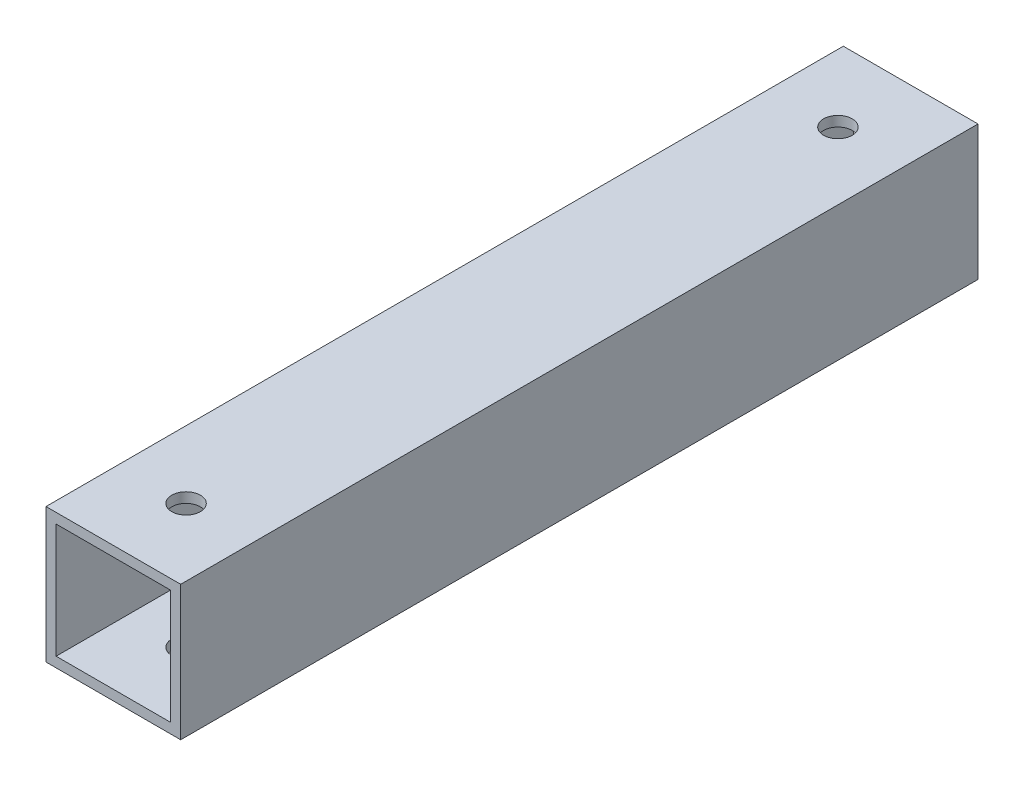
ISO-10303-21;
HEADER;
FILE_DESCRIPTION(('STEP AP214'),'2;1');
FILE_NAME('part.step','',(''),(''),'','','');
FILE_SCHEMA(('AUTOMOTIVE_DESIGN { 1 0 10303 214 1 1 1 1 }'));
ENDSEC;
DATA;
#1=APPLICATION_CONTEXT('core data for automotive mechanical design processes');
#2=APPLICATION_PROTOCOL_DEFINITION('international standard','automotive_design',2000,#1);
#3=PRODUCT_CONTEXT('',#1,'mechanical');
#4=PRODUCT('Part','Part','',(#3));
#5=PRODUCT_RELATED_PRODUCT_CATEGORY('part','',(#4));
#6=PRODUCT_DEFINITION_FORMATION('','',#4);
#7=PRODUCT_DEFINITION_CONTEXT('part definition',#1,'design');
#8=PRODUCT_DEFINITION('design','',#6,#7);
#9=PRODUCT_DEFINITION_SHAPE('','',#8);
#10=(LENGTH_UNIT() NAMED_UNIT(*) SI_UNIT(.MILLI.,.METRE.));
#11=(NAMED_UNIT(*) PLANE_ANGLE_UNIT() SI_UNIT($,.RADIAN.));
#12=(NAMED_UNIT(*) SI_UNIT($,.STERADIAN.) SOLID_ANGLE_UNIT());
#13=UNCERTAINTY_MEASURE_WITH_UNIT(LENGTH_MEASURE(1.E-05),#10,'distance_accuracy_value','');
#14=(GEOMETRIC_REPRESENTATION_CONTEXT(3) GLOBAL_UNCERTAINTY_ASSIGNED_CONTEXT((#13)) GLOBAL_UNIT_ASSIGNED_CONTEXT((#10,
#11,#12)) REPRESENTATION_CONTEXT('',''));
#15=CARTESIAN_POINT('',(0.,0.,0.));
#16=DIRECTION('',(0.,0.,1.));
#17=DIRECTION('',(1.,0.,0.));
#18=AXIS2_PLACEMENT_3D('',#15,#16,#17);
#19=CARTESIAN_POINT('',(10.,-9.99999999999999,-118.4));
#20=DIRECTION('',(1.,0.,0.));
#21=DIRECTION('',(0.,0.,-1.));
#22=AXIS2_PLACEMENT_3D('',#19,#20,#21);
#23=PLANE('',#22);
#24=DIRECTION('',(0.,1.,0.));
#25=VECTOR('',#24,1.);
#26=CARTESIAN_POINT('',(10.,-9.99999999999999,0.));
#27=LINE('',#26,#25);
#28=CARTESIAN_POINT('',(10.,-9.99999999999999,0.));
#29=VERTEX_POINT('',#28);
#30=CARTESIAN_POINT('',(10.,10.,0.));
#31=VERTEX_POINT('',#30);
#32=EDGE_CURVE('E144',#29,#31,#27,.T.);
#33=ORIENTED_EDGE('',*,*,#32,.F.);
#34=DIRECTION('',(0.,0.,1.));
#35=VECTOR('',#34,1.);
#36=CARTESIAN_POINT('',(10.,-9.99999999999999,-118.4));
#37=LINE('',#36,#35);
#38=CARTESIAN_POINT('',(10.,-9.99999999999999,-118.4));
#39=VERTEX_POINT('',#38);
#40=EDGE_CURVE('E11',#39,#29,#37,.T.);
#41=ORIENTED_EDGE('',*,*,#40,.F.);
#42=DIRECTION('',(0.,1.,0.));
#43=VECTOR('',#42,1.);
#44=CARTESIAN_POINT('',(10.,-9.99999999999999,-118.4));
#45=LINE('',#44,#43);
#46=CARTESIAN_POINT('',(10.,10.,-118.4));
#47=VERTEX_POINT('',#46);
#48=EDGE_CURVE('E148',#39,#47,#45,.T.);
#49=ORIENTED_EDGE('',*,*,#48,.T.);
#50=DIRECTION('',(0.,0.,1.));
#51=VECTOR('',#50,1.);
#52=CARTESIAN_POINT('',(10.,10.,-118.4));
#53=LINE('',#52,#51);
#54=EDGE_CURVE('E161',#47,#31,#53,.T.);
#55=ORIENTED_EDGE('',*,*,#54,.T.);
#56=EDGE_LOOP('',(#33,#41,#49,#55));
#57=FACE_BOUND('',#56,.T.);
#58=ADVANCED_FACE('F43',(#57),#23,.T.);
#59=CARTESIAN_POINT('',(-9.99999999999998,-9.99999999999999,-118.4));
#60=DIRECTION('',(0.,-1.,0.));
#61=DIRECTION('',(0.,0.,-1.));
#62=AXIS2_PLACEMENT_3D('',#59,#60,#61);
#63=PLANE('',#62);
#64=CARTESIAN_POINT('',(0.,-9.99999999999999,-10.8));
#65=DIRECTION('',(0.,1.,0.));
#66=DIRECTION('',(0.,0.,1.));
#67=AXIS2_PLACEMENT_3D('',#64,#65,#66);
#68=CIRCLE('',#67,2.125);
#69=CARTESIAN_POINT('',(0.,-9.99999999999999,-8.675));
#70=VERTEX_POINT('',#69);
#71=EDGE_CURVE('E178',#70,#70,#68,.T.);
#72=ORIENTED_EDGE('',*,*,#71,.T.);
#73=EDGE_LOOP('',(#72));
#74=FACE_BOUND('',#73,.T.);
#75=CARTESIAN_POINT('',(0.,-9.99999999999999,-107.6));
#76=DIRECTION('',(0.,1.,0.));
#77=DIRECTION('',(0.,0.,-1.));
#78=AXIS2_PLACEMENT_3D('',#75,#76,#77);
#79=CIRCLE('',#78,2.125);
#80=CARTESIAN_POINT('',(0.,-9.99999999999999,-109.725));
#81=VERTEX_POINT('',#80);
#82=EDGE_CURVE('E193',#81,#81,#79,.T.);
#83=ORIENTED_EDGE('',*,*,#82,.T.);
#84=EDGE_LOOP('',(#83));
#85=FACE_BOUND('',#84,.T.);
#86=DIRECTION('',(1.,0.,0.));
#87=VECTOR('',#86,1.);
#88=CARTESIAN_POINT('',(-9.99999999999998,-9.99999999999999,0.));
#89=LINE('',#88,#87);
#90=CARTESIAN_POINT('',(-9.99999999999998,-9.99999999999999,0.));
#91=VERTEX_POINT('',#90);
#92=EDGE_CURVE('E152',#91,#29,#89,.T.);
#93=ORIENTED_EDGE('',*,*,#92,.F.);
#94=DIRECTION('',(0.,0.,1.));
#95=VECTOR('',#94,1.);
#96=CARTESIAN_POINT('',(-9.99999999999998,-9.99999999999999,-118.4));
#97=LINE('',#96,#95);
#98=CARTESIAN_POINT('',(-9.99999999999998,-9.99999999999999,-118.4));
#99=VERTEX_POINT('',#98);
#100=EDGE_CURVE('E51',#99,#91,#97,.T.);
#101=ORIENTED_EDGE('',*,*,#100,.F.);
#102=DIRECTION('',(1.,0.,0.));
#103=VECTOR('',#102,1.);
#104=CARTESIAN_POINT('',(-9.99999999999998,-9.99999999999999,-118.4));
#105=LINE('',#104,#103);
#106=EDGE_CURVE('E158',#99,#39,#105,.T.);
#107=ORIENTED_EDGE('',*,*,#106,.T.);
#108=ORIENTED_EDGE('',*,*,#40,.T.);
#109=EDGE_LOOP('',(#93,#101,#107,#108));
#110=FACE_BOUND('',#109,.T.);
#111=ADVANCED_FACE('F197',(#74,#85,#110),#63,.T.);
#112=CARTESIAN_POINT('',(-9.99999999999998,-9.99999999999999,-118.4));
#113=DIRECTION('',(-1.,0.,0.));
#114=DIRECTION('',(0.,0.,1.));
#115=AXIS2_PLACEMENT_3D('',#112,#113,#114);
#116=PLANE('',#115);
#117=DIRECTION('',(0.,-1.,0.));
#118=VECTOR('',#117,1.);
#119=CARTESIAN_POINT('',(-9.99999999999998,-9.99999999999999,0.));
#120=LINE('',#119,#118);
#121=CARTESIAN_POINT('',(-9.99999999999998,10.,0.));
#122=VERTEX_POINT('',#121);
#123=EDGE_CURVE('E167',#122,#91,#120,.T.);
#124=ORIENTED_EDGE('',*,*,#123,.F.);
#125=DIRECTION('',(0.,0.,1.));
#126=VECTOR('',#125,1.);
#127=CARTESIAN_POINT('',(-9.99999999999998,10.,-118.4));
#128=LINE('',#127,#126);
#129=CARTESIAN_POINT('',(-9.99999999999998,10.,-118.4));
#130=VERTEX_POINT('',#129);
#131=EDGE_CURVE('E173',#130,#122,#128,.T.);
#132=ORIENTED_EDGE('',*,*,#131,.F.);
#133=DIRECTION('',(0.,-1.,0.));
#134=VECTOR('',#133,1.);
#135=CARTESIAN_POINT('',(-9.99999999999998,-9.99999999999999,-118.4));
#136=LINE('',#135,#134);
#137=EDGE_CURVE('E155',#130,#99,#136,.T.);
#138=ORIENTED_EDGE('',*,*,#137,.T.);
#139=ORIENTED_EDGE('',*,*,#100,.T.);
#140=EDGE_LOOP('',(#124,#132,#138,#139));
#141=FACE_BOUND('',#140,.T.);
#142=ADVANCED_FACE('F225',(#141),#116,.T.);
#143=CARTESIAN_POINT('',(-9.99999999999998,10.,-118.4));
#144=DIRECTION('',(0.,1.,0.));
#145=DIRECTION('',(0.,0.,1.));
#146=AXIS2_PLACEMENT_3D('',#143,#144,#145);
#147=PLANE('',#146);
#148=CARTESIAN_POINT('',(0.,10.,-10.8));
#149=DIRECTION('',(0.,1.,0.));
#150=DIRECTION('',(0.,0.,1.));
#151=AXIS2_PLACEMENT_3D('',#148,#149,#150);
#152=CIRCLE('',#151,2.125);
#153=CARTESIAN_POINT('',(0.,10.,-8.675));
#154=VERTEX_POINT('',#153);
#155=EDGE_CURVE('E183',#154,#154,#152,.T.);
#156=ORIENTED_EDGE('',*,*,#155,.F.);
#157=EDGE_LOOP('',(#156));
#158=FACE_BOUND('',#157,.T.);
#159=CARTESIAN_POINT('',(0.,10.,-107.6));
#160=DIRECTION('',(0.,1.,0.));
#161=DIRECTION('',(0.,0.,-1.));
#162=AXIS2_PLACEMENT_3D('',#159,#160,#161);
#163=CIRCLE('',#162,2.125);
#164=CARTESIAN_POINT('',(0.,10.,-109.725));
#165=VERTEX_POINT('',#164);
#166=EDGE_CURVE('E188',#165,#165,#163,.T.);
#167=ORIENTED_EDGE('',*,*,#166,.F.);
#168=EDGE_LOOP('',(#167));
#169=FACE_BOUND('',#168,.T.);
#170=DIRECTION('',(-1.,0.,0.));
#171=VECTOR('',#170,1.);
#172=CARTESIAN_POINT('',(-9.99999999999998,10.,0.));
#173=LINE('',#172,#171);
#174=EDGE_CURVE('E164',#31,#122,#173,.T.);
#175=ORIENTED_EDGE('',*,*,#174,.F.);
#176=ORIENTED_EDGE('',*,*,#54,.F.);
#177=DIRECTION('',(-1.,0.,0.));
#178=VECTOR('',#177,1.);
#179=CARTESIAN_POINT('',(-9.99999999999998,10.,-118.4));
#180=LINE('',#179,#178);
#181=EDGE_CURVE('E151',#47,#130,#180,.T.);
#182=ORIENTED_EDGE('',*,*,#181,.T.);
#183=ORIENTED_EDGE('',*,*,#131,.T.);
#184=EDGE_LOOP('',(#175,#176,#182,#183));
#185=FACE_BOUND('',#184,.T.);
#186=ADVANCED_FACE('F238',(#158,#169,#185),#147,.T.);
#187=CARTESIAN_POINT('',(0.,0.,-118.4));
#188=DIRECTION('',(0.,0.,-1.));
#189=DIRECTION('',(-1.,0.,0.));
#190=AXIS2_PLACEMENT_3D('',#187,#188,#189);
#191=PLANE('',#190);
#192=DIRECTION('',(0.,-1.,0.));
#193=VECTOR('',#192,1.);
#194=CARTESIAN_POINT('',(-8.49999999999998,-8.49999999999999,-118.4));
#195=LINE('',#194,#193);
#196=CARTESIAN_POINT('',(-8.49999999999998,8.50000000000002,-118.4));
#197=VERTEX_POINT('',#196);
#198=CARTESIAN_POINT('',(-8.49999999999998,-8.49999999999999,-118.4));
#199=VERTEX_POINT('',#198);
#200=EDGE_CURVE('E110',#197,#199,#195,.T.);
#201=ORIENTED_EDGE('',*,*,#200,.T.);
#202=DIRECTION('',(1.,0.,0.));
#203=VECTOR('',#202,1.);
#204=CARTESIAN_POINT('',(-8.49999999999998,-8.49999999999999,-118.4));
#205=LINE('',#204,#203);
#206=CARTESIAN_POINT('',(8.50000000000002,-8.49999999999999,-118.4));
#207=VERTEX_POINT('',#206);
#208=EDGE_CURVE('E119',#199,#207,#205,.T.);
#209=ORIENTED_EDGE('',*,*,#208,.T.);
#210=DIRECTION('',(0.,1.,0.));
#211=VECTOR('',#210,1.);
#212=CARTESIAN_POINT('',(8.50000000000002,-8.49999999999999,-118.4));
#213=LINE('',#212,#211);
#214=CARTESIAN_POINT('',(8.50000000000002,8.50000000000002,-118.4));
#215=VERTEX_POINT('',#214);
#216=EDGE_CURVE('E59',#207,#215,#213,.T.);
#217=ORIENTED_EDGE('',*,*,#216,.T.);
#218=DIRECTION('',(-1.,0.,0.));
#219=VECTOR('',#218,1.);
#220=CARTESIAN_POINT('',(-8.49999999999998,8.50000000000002,-118.4));
#221=LINE('',#220,#219);
#222=EDGE_CURVE('E116',#215,#197,#221,.T.);
#223=ORIENTED_EDGE('',*,*,#222,.T.);
#224=EDGE_LOOP('',(#201,#209,#217,#223));
#225=FACE_BOUND('',#224,.T.);
#226=ORIENTED_EDGE('',*,*,#48,.F.);
#227=ORIENTED_EDGE('',*,*,#106,.F.);
#228=ORIENTED_EDGE('',*,*,#137,.F.);
#229=ORIENTED_EDGE('',*,*,#181,.F.);
#230=EDGE_LOOP('',(#226,#227,#228,#229));
#231=FACE_BOUND('',#230,.T.);
#232=ADVANCED_FACE('F123',(#225,#231),#191,.T.);
#233=CARTESIAN_POINT('',(0.,0.,0.));
#234=DIRECTION('',(0.,0.,-1.));
#235=DIRECTION('',(-1.,0.,0.));
#236=AXIS2_PLACEMENT_3D('',#233,#234,#235);
#237=PLANE('',#236);
#238=DIRECTION('',(1.,0.,0.));
#239=VECTOR('',#238,1.);
#240=CARTESIAN_POINT('',(-8.49999999999998,-8.49999999999999,0.));
#241=LINE('',#240,#239);
#242=CARTESIAN_POINT('',(-8.49999999999998,-8.49999999999999,0.));
#243=VERTEX_POINT('',#242);
#244=CARTESIAN_POINT('',(8.50000000000002,-8.49999999999999,0.));
#245=VERTEX_POINT('',#244);
#246=EDGE_CURVE('E138',#243,#245,#241,.T.);
#247=ORIENTED_EDGE('',*,*,#246,.F.);
#248=DIRECTION('',(0.,-1.,0.));
#249=VECTOR('',#248,1.);
#250=CARTESIAN_POINT('',(-8.49999999999998,-8.49999999999999,0.));
#251=LINE('',#250,#249);
#252=CARTESIAN_POINT('',(-8.49999999999998,8.50000000000002,0.));
#253=VERTEX_POINT('',#252);
#254=EDGE_CURVE('E67',#253,#243,#251,.T.);
#255=ORIENTED_EDGE('',*,*,#254,.F.);
#256=DIRECTION('',(-1.,0.,0.));
#257=VECTOR('',#256,1.);
#258=CARTESIAN_POINT('',(-8.49999999999998,8.50000000000002,0.));
#259=LINE('',#258,#257);
#260=CARTESIAN_POINT('',(8.50000000000002,8.50000000000002,0.));
#261=VERTEX_POINT('',#260);
#262=EDGE_CURVE('E126',#261,#253,#259,.T.);
#263=ORIENTED_EDGE('',*,*,#262,.F.);
#264=DIRECTION('',(0.,1.,0.));
#265=VECTOR('',#264,1.);
#266=CARTESIAN_POINT('',(8.50000000000002,-8.49999999999999,0.));
#267=LINE('',#266,#265);
#268=EDGE_CURVE('E129',#245,#261,#267,.T.);
#269=ORIENTED_EDGE('',*,*,#268,.F.);
#270=EDGE_LOOP('',(#247,#255,#263,#269));
#271=FACE_BOUND('',#270,.T.);
#272=ORIENTED_EDGE('',*,*,#32,.T.);
#273=ORIENTED_EDGE('',*,*,#174,.T.);
#274=ORIENTED_EDGE('',*,*,#123,.T.);
#275=ORIENTED_EDGE('',*,*,#92,.T.);
#276=EDGE_LOOP('',(#272,#273,#274,#275));
#277=FACE_BOUND('',#276,.T.);
#278=ADVANCED_FACE('F232',(#271,#277),#237,.F.);
#279=CARTESIAN_POINT('',(-8.49999999999998,-8.49999999999999,-118.4));
#280=DIRECTION('',(-1.,0.,0.));
#281=DIRECTION('',(0.,0.,1.));
#282=AXIS2_PLACEMENT_3D('',#279,#280,#281);
#283=PLANE('',#282);
#284=ORIENTED_EDGE('',*,*,#254,.T.);
#285=DIRECTION('',(0.,0.,1.));
#286=VECTOR('',#285,1.);
#287=CARTESIAN_POINT('',(-8.49999999999998,-8.49999999999999,-118.4));
#288=LINE('',#287,#286);
#289=EDGE_CURVE('E106',#199,#243,#288,.T.);
#290=ORIENTED_EDGE('',*,*,#289,.F.);
#291=ORIENTED_EDGE('',*,*,#200,.F.);
#292=DIRECTION('',(0.,0.,1.));
#293=VECTOR('',#292,1.);
#294=CARTESIAN_POINT('',(-8.49999999999998,8.50000000000002,-118.4));
#295=LINE('',#294,#293);
#296=EDGE_CURVE('E142',#197,#253,#295,.T.);
#297=ORIENTED_EDGE('',*,*,#296,.T.);
#298=EDGE_LOOP('',(#284,#290,#291,#297));
#299=FACE_BOUND('',#298,.T.);
#300=ADVANCED_FACE('F108',(#299),#283,.F.);
#301=CARTESIAN_POINT('',(-8.49999999999998,8.50000000000002,-118.4));
#302=DIRECTION('',(0.,1.,0.));
#303=DIRECTION('',(0.,0.,1.));
#304=AXIS2_PLACEMENT_3D('',#301,#302,#303);
#305=PLANE('',#304);
#306=CARTESIAN_POINT('',(0.,8.50000000000002,-10.8));
#307=DIRECTION('',(0.,1.,0.));
#308=DIRECTION('',(0.,0.,1.));
#309=AXIS2_PLACEMENT_3D('',#306,#307,#308);
#310=CIRCLE('',#309,2.125);
#311=CARTESIAN_POINT('',(0.,8.50000000000002,-8.675));
#312=VERTEX_POINT('',#311);
#313=EDGE_CURVE('E132',#312,#312,#310,.T.);
#314=ORIENTED_EDGE('',*,*,#313,.T.);
#315=EDGE_LOOP('',(#314));
#316=FACE_BOUND('',#315,.T.);
#317=CARTESIAN_POINT('',(0.,8.50000000000002,-107.6));
#318=DIRECTION('',(0.,1.,0.));
#319=DIRECTION('',(0.,0.,1.));
#320=AXIS2_PLACEMENT_3D('',#317,#318,#319);
#321=CIRCLE('',#320,2.125);
#322=CARTESIAN_POINT('',(0.,8.50000000000002,-105.475));
#323=VERTEX_POINT('',#322);
#324=EDGE_CURVE('E177',#323,#323,#321,.T.);
#325=ORIENTED_EDGE('',*,*,#324,.T.);
#326=EDGE_LOOP('',(#325));
#327=FACE_BOUND('',#326,.T.);
#328=ORIENTED_EDGE('',*,*,#262,.T.);
#329=ORIENTED_EDGE('',*,*,#296,.F.);
#330=ORIENTED_EDGE('',*,*,#222,.F.);
#331=DIRECTION('',(0.,0.,1.));
#332=VECTOR('',#331,1.);
#333=CARTESIAN_POINT('',(8.50000000000002,8.50000000000002,-118.4));
#334=LINE('',#333,#332);
#335=EDGE_CURVE('E145',#215,#261,#334,.T.);
#336=ORIENTED_EDGE('',*,*,#335,.T.);
#337=EDGE_LOOP('',(#328,#329,#330,#336));
#338=FACE_BOUND('',#337,.T.);
#339=ADVANCED_FACE('F252',(#316,#327,#338),#305,.F.);
#340=CARTESIAN_POINT('',(8.50000000000002,-8.49999999999999,-118.4));
#341=DIRECTION('',(1.,0.,0.));
#342=DIRECTION('',(0.,0.,-1.));
#343=AXIS2_PLACEMENT_3D('',#340,#341,#342);
#344=PLANE('',#343);
#345=ORIENTED_EDGE('',*,*,#268,.T.);
#346=ORIENTED_EDGE('',*,*,#335,.F.);
#347=ORIENTED_EDGE('',*,*,#216,.F.);
#348=DIRECTION('',(0.,0.,1.));
#349=VECTOR('',#348,1.);
#350=CARTESIAN_POINT('',(8.50000000000002,-8.49999999999999,-118.4));
#351=LINE('',#350,#349);
#352=EDGE_CURVE('E115',#207,#245,#351,.T.);
#353=ORIENTED_EDGE('',*,*,#352,.T.);
#354=EDGE_LOOP('',(#345,#346,#347,#353));
#355=FACE_BOUND('',#354,.T.);
#356=ADVANCED_FACE('F213',(#355),#344,.F.);
#357=CARTESIAN_POINT('',(-8.49999999999998,-8.49999999999999,-118.4));
#358=DIRECTION('',(0.,-1.,0.));
#359=DIRECTION('',(0.,0.,-1.));
#360=AXIS2_PLACEMENT_3D('',#357,#358,#359);
#361=PLANE('',#360);
#362=CARTESIAN_POINT('',(0.,-8.49999999999999,-10.8));
#363=DIRECTION('',(0.,-1.,0.));
#364=DIRECTION('',(0.,0.,-1.));
#365=AXIS2_PLACEMENT_3D('',#362,#363,#364);
#366=CIRCLE('',#365,2.125);
#367=CARTESIAN_POINT('',(0.,-8.49999999999999,-12.925));
#368=VERTEX_POINT('',#367);
#369=EDGE_CURVE('E46',#368,#368,#366,.T.);
#370=ORIENTED_EDGE('',*,*,#369,.T.);
#371=EDGE_LOOP('',(#370));
#372=FACE_BOUND('',#371,.T.);
#373=CARTESIAN_POINT('',(0.,-8.49999999999999,-107.6));
#374=DIRECTION('',(0.,-1.,0.));
#375=DIRECTION('',(0.,0.,-1.));
#376=AXIS2_PLACEMENT_3D('',#373,#374,#375);
#377=CIRCLE('',#376,2.125);
#378=CARTESIAN_POINT('',(0.,-8.49999999999999,-109.725));
#379=VERTEX_POINT('',#378);
#380=EDGE_CURVE('E175',#379,#379,#377,.T.);
#381=ORIENTED_EDGE('',*,*,#380,.T.);
#382=EDGE_LOOP('',(#381));
#383=FACE_BOUND('',#382,.T.);
#384=ORIENTED_EDGE('',*,*,#246,.T.);
#385=ORIENTED_EDGE('',*,*,#352,.F.);
#386=ORIENTED_EDGE('',*,*,#208,.F.);
#387=ORIENTED_EDGE('',*,*,#289,.T.);
#388=EDGE_LOOP('',(#384,#385,#386,#387));
#389=FACE_BOUND('',#388,.T.);
#390=ADVANCED_FACE('F120',(#372,#383,#389),#361,.F.);
#391=CARTESIAN_POINT('',(0.,-9.99999999999999,-107.6));
#392=DIRECTION('',(0.,1.,0.));
#393=DIRECTION('',(0.,0.,1.));
#394=AXIS2_PLACEMENT_3D('',#391,#392,#393);
#395=CYLINDRICAL_SURFACE('',#394,2.125);
#396=ORIENTED_EDGE('',*,*,#82,.F.);
#397=EDGE_LOOP('',(#396));
#398=FACE_BOUND('',#397,.T.);
#399=ORIENTED_EDGE('',*,*,#380,.F.);
#400=EDGE_LOOP('',(#399));
#401=FACE_BOUND('',#400,.T.);
#402=ADVANCED_FACE('F200',(#398,#401),#395,.F.);
#403=CARTESIAN_POINT('',(0.,-9.99999999999999,-10.8));
#404=DIRECTION('',(0.,1.,0.));
#405=DIRECTION('',(0.,0.,1.));
#406=AXIS2_PLACEMENT_3D('',#403,#404,#405);
#407=CYLINDRICAL_SURFACE('',#406,2.125);
#408=ORIENTED_EDGE('',*,*,#71,.F.);
#409=EDGE_LOOP('',(#408));
#410=FACE_BOUND('',#409,.T.);
#411=ORIENTED_EDGE('',*,*,#369,.F.);
#412=EDGE_LOOP('',(#411));
#413=FACE_BOUND('',#412,.T.);
#414=ADVANCED_FACE('F203',(#410,#413),#407,.F.);
#415=ORIENTED_EDGE('',*,*,#166,.T.);
#416=EDGE_LOOP('',(#415));
#417=FACE_BOUND('',#416,.T.);
#418=ORIENTED_EDGE('',*,*,#324,.F.);
#419=EDGE_LOOP('',(#418));
#420=FACE_BOUND('',#419,.T.);
#421=ADVANCED_FACE('F205',(#417,#420),#395,.F.);
#422=ORIENTED_EDGE('',*,*,#155,.T.);
#423=EDGE_LOOP('',(#422));
#424=FACE_BOUND('',#423,.T.);
#425=ORIENTED_EDGE('',*,*,#313,.F.);
#426=EDGE_LOOP('',(#425));
#427=FACE_BOUND('',#426,.T.);
#428=ADVANCED_FACE('F212',(#424,#427),#407,.F.);
#429=CLOSED_SHELL('',(#58,#111,#142,#186,#232,#278,#300,#339,#356,#390,#402,#414,#421,#428));
#430=MANIFOLD_SOLID_BREP('B2',#429);
#431=ADVANCED_BREP_SHAPE_REPRESENTATION('',(#18,#430),#14);
#432=SHAPE_DEFINITION_REPRESENTATION(#9,#431);
ENDSEC;
END-ISO-10303-21;
